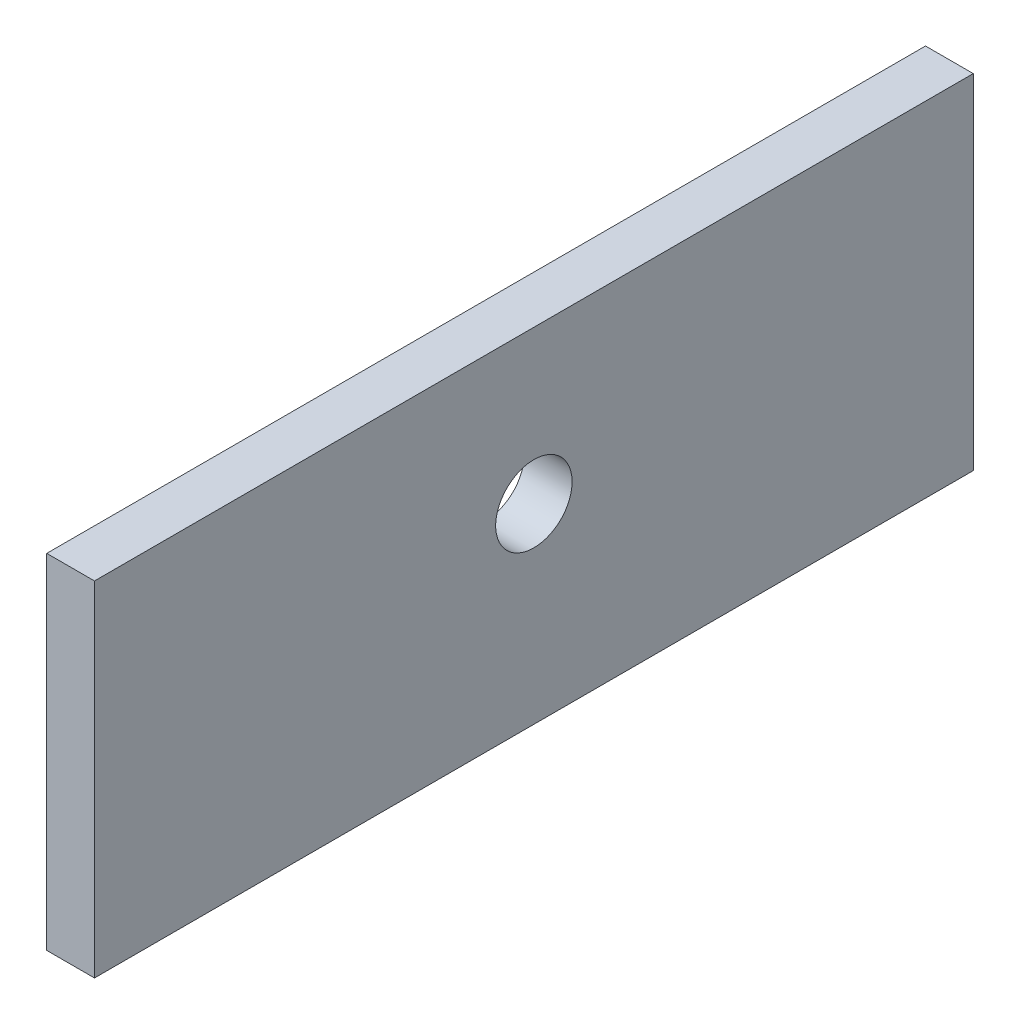
ISO-10303-21;
HEADER;
FILE_DESCRIPTION(('STEP AP214'),'2;1');
FILE_NAME('part.step','',(''),(''),'','','');
FILE_SCHEMA(('AUTOMOTIVE_DESIGN { 1 0 10303 214 1 1 1 1 }'));
ENDSEC;
DATA;
#1=APPLICATION_CONTEXT('core data for automotive mechanical design processes');
#2=APPLICATION_PROTOCOL_DEFINITION('international standard','automotive_design',2000,#1);
#3=PRODUCT_CONTEXT('',#1,'mechanical');
#4=PRODUCT('Part','Part','',(#3));
#5=PRODUCT_RELATED_PRODUCT_CATEGORY('part','',(#4));
#6=PRODUCT_DEFINITION_FORMATION('','',#4);
#7=PRODUCT_DEFINITION_CONTEXT('part definition',#1,'design');
#8=PRODUCT_DEFINITION('design','',#6,#7);
#9=PRODUCT_DEFINITION_SHAPE('','',#8);
#10=(LENGTH_UNIT() NAMED_UNIT(*) SI_UNIT(.MILLI.,.METRE.));
#11=(NAMED_UNIT(*) PLANE_ANGLE_UNIT() SI_UNIT($,.RADIAN.));
#12=(NAMED_UNIT(*) SI_UNIT($,.STERADIAN.) SOLID_ANGLE_UNIT());
#13=UNCERTAINTY_MEASURE_WITH_UNIT(LENGTH_MEASURE(1.E-05),#10,'distance_accuracy_value','');
#14=(GEOMETRIC_REPRESENTATION_CONTEXT(3) GLOBAL_UNCERTAINTY_ASSIGNED_CONTEXT((#13)) GLOBAL_UNIT_ASSIGNED_CONTEXT((#10,
#11,#12)) REPRESENTATION_CONTEXT('',''));
#15=CARTESIAN_POINT('',(0.,0.,0.));
#16=DIRECTION('',(0.,0.,1.));
#17=DIRECTION('',(1.,0.,0.));
#18=AXIS2_PLACEMENT_3D('',#15,#16,#17);
#19=CARTESIAN_POINT('',(2.5,0.,0.));
#20=DIRECTION('',(0.,0.,-1.));
#21=DIRECTION('',(-1.,0.,0.));
#22=AXIS2_PLACEMENT_3D('',#19,#20,#21);
#23=PLANE('',#22);
#24=DIRECTION('',(0.,-1.,0.));
#25=VECTOR('',#24,1.);
#26=CARTESIAN_POINT('',(0.,0.,0.));
#27=LINE('',#26,#25);
#28=CARTESIAN_POINT('',(0.,18.,0.));
#29=VERTEX_POINT('',#28);
#30=CARTESIAN_POINT('',(0.,0.,0.));
#31=VERTEX_POINT('',#30);
#32=EDGE_CURVE('E96',#29,#31,#27,.T.);
#33=ORIENTED_EDGE('',*,*,#32,.T.);
#34=DIRECTION('',(-1.,0.,0.));
#35=VECTOR('',#34,1.);
#36=CARTESIAN_POINT('',(2.5,0.,0.));
#37=LINE('',#36,#35);
#38=CARTESIAN_POINT('',(2.5,0.,0.));
#39=VERTEX_POINT('',#38);
#40=EDGE_CURVE('E11',#39,#31,#37,.T.);
#41=ORIENTED_EDGE('',*,*,#40,.F.);
#42=DIRECTION('',(0.,-1.,0.));
#43=VECTOR('',#42,1.);
#44=CARTESIAN_POINT('',(2.5,0.,0.));
#45=LINE('',#44,#43);
#46=CARTESIAN_POINT('',(2.5,18.,0.));
#47=VERTEX_POINT('',#46);
#48=EDGE_CURVE('E84',#47,#39,#45,.T.);
#49=ORIENTED_EDGE('',*,*,#48,.F.);
#50=DIRECTION('',(-1.,0.,0.));
#51=VECTOR('',#50,1.);
#52=CARTESIAN_POINT('',(2.5,18.,0.));
#53=LINE('',#52,#51);
#54=EDGE_CURVE('E92',#47,#29,#53,.T.);
#55=ORIENTED_EDGE('',*,*,#54,.T.);
#56=EDGE_LOOP('',(#33,#41,#49,#55));
#57=FACE_BOUND('',#56,.T.);
#58=ADVANCED_FACE('F33',(#57),#23,.F.);
#59=CARTESIAN_POINT('',(2.5,0.,0.));
#60=DIRECTION('',(0.,1.,0.));
#61=DIRECTION('',(0.,0.,1.));
#62=AXIS2_PLACEMENT_3D('',#59,#60,#61);
#63=PLANE('',#62);
#64=DIRECTION('',(0.,0.,-1.));
#65=VECTOR('',#64,1.);
#66=CARTESIAN_POINT('',(0.,0.,0.));
#67=LINE('',#66,#65);
#68=CARTESIAN_POINT('',(0.,0.,-46.));
#69=VERTEX_POINT('',#68);
#70=EDGE_CURVE('E88',#31,#69,#67,.T.);
#71=ORIENTED_EDGE('',*,*,#70,.T.);
#72=DIRECTION('',(-1.,0.,0.));
#73=VECTOR('',#72,1.);
#74=CARTESIAN_POINT('',(2.5,0.,-46.));
#75=LINE('',#74,#73);
#76=CARTESIAN_POINT('',(2.5,0.,-46.));
#77=VERTEX_POINT('',#76);
#78=EDGE_CURVE('E41',#77,#69,#75,.T.);
#79=ORIENTED_EDGE('',*,*,#78,.F.);
#80=DIRECTION('',(0.,0.,-1.));
#81=VECTOR('',#80,1.);
#82=CARTESIAN_POINT('',(2.5,0.,0.));
#83=LINE('',#82,#81);
#84=EDGE_CURVE('E79',#39,#77,#83,.T.);
#85=ORIENTED_EDGE('',*,*,#84,.F.);
#86=ORIENTED_EDGE('',*,*,#40,.T.);
#87=EDGE_LOOP('',(#71,#79,#85,#86));
#88=FACE_BOUND('',#87,.T.);
#89=ADVANCED_FACE('F87',(#88),#63,.F.);
#90=CARTESIAN_POINT('',(2.5,0.,-46.));
#91=DIRECTION('',(0.,0.,1.));
#92=DIRECTION('',(1.,0.,0.));
#93=AXIS2_PLACEMENT_3D('',#90,#91,#92);
#94=PLANE('',#93);
#95=DIRECTION('',(0.,1.,0.));
#96=VECTOR('',#95,1.);
#97=CARTESIAN_POINT('',(0.,0.,-46.));
#98=LINE('',#97,#96);
#99=CARTESIAN_POINT('',(0.,18.,-46.));
#100=VERTEX_POINT('',#99);
#101=EDGE_CURVE('E66',#69,#100,#98,.T.);
#102=ORIENTED_EDGE('',*,*,#101,.T.);
#103=DIRECTION('',(-1.,0.,0.));
#104=VECTOR('',#103,1.);
#105=CARTESIAN_POINT('',(2.5,18.,-46.));
#106=LINE('',#105,#104);
#107=CARTESIAN_POINT('',(2.5,18.,-46.));
#108=VERTEX_POINT('',#107);
#109=EDGE_CURVE('E89',#108,#100,#106,.T.);
#110=ORIENTED_EDGE('',*,*,#109,.F.);
#111=DIRECTION('',(0.,1.,0.));
#112=VECTOR('',#111,1.);
#113=CARTESIAN_POINT('',(2.5,0.,-46.));
#114=LINE('',#113,#112);
#115=EDGE_CURVE('E82',#77,#108,#114,.T.);
#116=ORIENTED_EDGE('',*,*,#115,.F.);
#117=ORIENTED_EDGE('',*,*,#78,.T.);
#118=EDGE_LOOP('',(#102,#110,#116,#117));
#119=FACE_BOUND('',#118,.T.);
#120=ADVANCED_FACE('F90',(#119),#94,.F.);
#121=CARTESIAN_POINT('',(2.5,18.,0.));
#122=DIRECTION('',(0.,-1.,0.));
#123=DIRECTION('',(0.,0.,-1.));
#124=AXIS2_PLACEMENT_3D('',#121,#122,#123);
#125=PLANE('',#124);
#126=DIRECTION('',(0.,0.,1.));
#127=VECTOR('',#126,1.);
#128=CARTESIAN_POINT('',(0.,18.,0.));
#129=LINE('',#128,#127);
#130=EDGE_CURVE('E72',#100,#29,#129,.T.);
#131=ORIENTED_EDGE('',*,*,#130,.T.);
#132=ORIENTED_EDGE('',*,*,#54,.F.);
#133=DIRECTION('',(0.,0.,1.));
#134=VECTOR('',#133,1.);
#135=CARTESIAN_POINT('',(2.5,18.,0.));
#136=LINE('',#135,#134);
#137=EDGE_CURVE('E49',#108,#47,#136,.T.);
#138=ORIENTED_EDGE('',*,*,#137,.F.);
#139=ORIENTED_EDGE('',*,*,#109,.T.);
#140=EDGE_LOOP('',(#131,#132,#138,#139));
#141=FACE_BOUND('',#140,.T.);
#142=ADVANCED_FACE('F104',(#141),#125,.F.);
#143=CARTESIAN_POINT('',(2.5,0.,0.));
#144=DIRECTION('',(-1.,0.,0.));
#145=DIRECTION('',(0.,0.,1.));
#146=AXIS2_PLACEMENT_3D('',#143,#144,#145);
#147=PLANE('',#146);
#148=CARTESIAN_POINT('',(2.5,10.,-23.));
#149=DIRECTION('',(1.,0.,0.));
#150=DIRECTION('',(0.,0.,-1.));
#151=AXIS2_PLACEMENT_3D('',#148,#149,#150);
#152=CIRCLE('',#151,2.);
#153=CARTESIAN_POINT('',(2.5,10.,-25.));
#154=VERTEX_POINT('',#153);
#155=EDGE_CURVE('E110',#154,#154,#152,.T.);
#156=ORIENTED_EDGE('',*,*,#155,.F.);
#157=EDGE_LOOP('',(#156));
#158=FACE_BOUND('',#157,.T.);
#159=ORIENTED_EDGE('',*,*,#48,.T.);
#160=ORIENTED_EDGE('',*,*,#84,.T.);
#161=ORIENTED_EDGE('',*,*,#115,.T.);
#162=ORIENTED_EDGE('',*,*,#137,.T.);
#163=EDGE_LOOP('',(#159,#160,#161,#162));
#164=FACE_BOUND('',#163,.T.);
#165=ADVANCED_FACE('F80',(#158,#164),#147,.F.);
#166=CARTESIAN_POINT('',(0.,0.,0.));
#167=DIRECTION('',(-1.,0.,0.));
#168=DIRECTION('',(0.,0.,1.));
#169=AXIS2_PLACEMENT_3D('',#166,#167,#168);
#170=PLANE('',#169);
#171=CARTESIAN_POINT('',(0.,10.,-23.));
#172=DIRECTION('',(1.,0.,0.));
#173=DIRECTION('',(0.,0.,-1.));
#174=AXIS2_PLACEMENT_3D('',#171,#172,#173);
#175=CIRCLE('',#174,2.);
#176=CARTESIAN_POINT('',(0.,10.,-25.));
#177=VERTEX_POINT('',#176);
#178=EDGE_CURVE('E99',#177,#177,#175,.T.);
#179=ORIENTED_EDGE('',*,*,#178,.T.);
#180=EDGE_LOOP('',(#179));
#181=FACE_BOUND('',#180,.T.);
#182=ORIENTED_EDGE('',*,*,#32,.F.);
#183=ORIENTED_EDGE('',*,*,#130,.F.);
#184=ORIENTED_EDGE('',*,*,#101,.F.);
#185=ORIENTED_EDGE('',*,*,#70,.F.);
#186=EDGE_LOOP('',(#182,#183,#184,#185));
#187=FACE_BOUND('',#186,.T.);
#188=ADVANCED_FACE('F107',(#181,#187),#170,.T.);
#189=CARTESIAN_POINT('',(0.,10.,-23.));
#190=DIRECTION('',(1.,0.,0.));
#191=DIRECTION('',(0.,0.,-1.));
#192=AXIS2_PLACEMENT_3D('',#189,#190,#191);
#193=CYLINDRICAL_SURFACE('',#192,2.);
#194=ORIENTED_EDGE('',*,*,#178,.F.);
#195=EDGE_LOOP('',(#194));
#196=FACE_BOUND('',#195,.T.);
#197=ORIENTED_EDGE('',*,*,#155,.T.);
#198=EDGE_LOOP('',(#197));
#199=FACE_BOUND('',#198,.T.);
#200=ADVANCED_FACE('F117',(#196,#199),#193,.F.);
#201=CLOSED_SHELL('',(#58,#89,#120,#142,#165,#188,#200));
#202=MANIFOLD_SOLID_BREP('B2',#201);
#203=ADVANCED_BREP_SHAPE_REPRESENTATION('',(#18,#202),#14);
#204=SHAPE_DEFINITION_REPRESENTATION(#9,#203);
ENDSEC;
END-ISO-10303-21;
